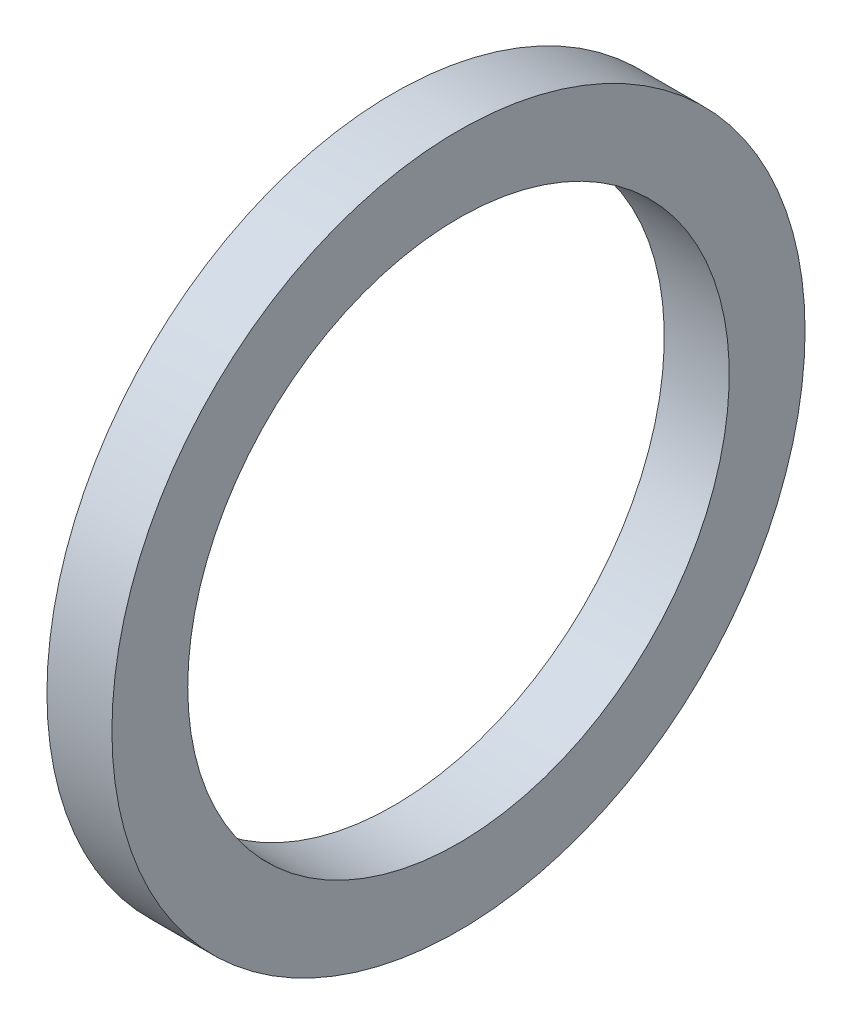
ISO-10303-21;
HEADER;
FILE_DESCRIPTION(('STEP AP214'),'2;1');
FILE_NAME('part.step','',(''),(''),'','','');
FILE_SCHEMA(('AUTOMOTIVE_DESIGN { 1 0 10303 214 1 1 1 1 }'));
ENDSEC;
DATA;
#1=APPLICATION_CONTEXT('core data for automotive mechanical design processes');
#2=APPLICATION_PROTOCOL_DEFINITION('international standard','automotive_design',2000,#1);
#3=PRODUCT_CONTEXT('',#1,'mechanical');
#4=PRODUCT('Part','Part','',(#3));
#5=PRODUCT_RELATED_PRODUCT_CATEGORY('part','',(#4));
#6=PRODUCT_DEFINITION_FORMATION('','',#4);
#7=PRODUCT_DEFINITION_CONTEXT('part definition',#1,'design');
#8=PRODUCT_DEFINITION('design','',#6,#7);
#9=PRODUCT_DEFINITION_SHAPE('','',#8);
#10=(LENGTH_UNIT() NAMED_UNIT(*) SI_UNIT(.MILLI.,.METRE.));
#11=(NAMED_UNIT(*) PLANE_ANGLE_UNIT() SI_UNIT($,.RADIAN.));
#12=(NAMED_UNIT(*) SI_UNIT($,.STERADIAN.) SOLID_ANGLE_UNIT());
#13=UNCERTAINTY_MEASURE_WITH_UNIT(LENGTH_MEASURE(1.E-05),#10,'distance_accuracy_value','');
#14=(GEOMETRIC_REPRESENTATION_CONTEXT(3) GLOBAL_UNCERTAINTY_ASSIGNED_CONTEXT((#13)) GLOBAL_UNIT_ASSIGNED_CONTEXT((#10,
#11,#12)) REPRESENTATION_CONTEXT('',''));
#15=CARTESIAN_POINT('',(0.,0.,0.));
#16=DIRECTION('',(0.,0.,1.));
#17=DIRECTION('',(1.,0.,0.));
#18=AXIS2_PLACEMENT_3D('',#15,#16,#17);
#19=CARTESIAN_POINT('',(0.,0.,0.));
#20=DIRECTION('',(-1.,0.,0.));
#21=DIRECTION('',(0.,0.,1.));
#22=AXIS2_PLACEMENT_3D('',#19,#20,#21);
#23=PLANE('',#22);
#24=CARTESIAN_POINT('',(0.,-12.5,0.));
#25=DIRECTION('',(-1.,0.,0.));
#26=DIRECTION('',(0.,0.,1.));
#27=AXIS2_PLACEMENT_3D('',#24,#25,#26);
#28=CIRCLE('',#27,16.);
#29=CARTESIAN_POINT('',(0.,-12.5,16.));
#30=VERTEX_POINT('',#29);
#31=EDGE_CURVE('E49',#30,#30,#28,.T.);
#32=ORIENTED_EDGE('',*,*,#31,.F.);
#33=EDGE_LOOP('',(#32));
#34=FACE_BOUND('',#33,.T.);
#35=CARTESIAN_POINT('',(0.,-12.5,0.));
#36=DIRECTION('',(-1.,0.,0.));
#37=DIRECTION('',(0.,0.,1.));
#38=AXIS2_PLACEMENT_3D('',#35,#36,#37);
#39=CIRCLE('',#38,12.5);
#40=CARTESIAN_POINT('',(0.,-12.5,12.5));
#41=VERTEX_POINT('',#40);
#42=EDGE_CURVE('E10',#41,#41,#39,.T.);
#43=ORIENTED_EDGE('',*,*,#42,.T.);
#44=EDGE_LOOP('',(#43));
#45=FACE_BOUND('',#44,.T.);
#46=ADVANCED_FACE('F35',(#34,#45),#23,.F.);
#47=CARTESIAN_POINT('',(0.,-12.5,0.));
#48=DIRECTION('',(-1.,0.,0.));
#49=DIRECTION('',(0.,0.,1.));
#50=AXIS2_PLACEMENT_3D('',#47,#48,#49);
#51=CYLINDRICAL_SURFACE('',#50,12.5);
#52=CARTESIAN_POINT('',(-3.,-12.5,0.));
#53=DIRECTION('',(-1.,0.,0.));
#54=DIRECTION('',(0.,0.,1.));
#55=AXIS2_PLACEMENT_3D('',#52,#53,#54);
#56=CIRCLE('',#55,12.5);
#57=CARTESIAN_POINT('',(-3.,-12.5,12.5));
#58=VERTEX_POINT('',#57);
#59=EDGE_CURVE('E41',#58,#58,#56,.T.);
#60=ORIENTED_EDGE('',*,*,#59,.T.);
#61=EDGE_LOOP('',(#60));
#62=FACE_BOUND('',#61,.T.);
#63=ORIENTED_EDGE('',*,*,#42,.F.);
#64=EDGE_LOOP('',(#63));
#65=FACE_BOUND('',#64,.T.);
#66=ADVANCED_FACE('F59',(#62,#65),#51,.F.);
#67=CARTESIAN_POINT('',(-3.,3.50000000000001,0.));
#68=DIRECTION('',(1.,0.,0.));
#69=DIRECTION('',(0.,0.,-1.));
#70=AXIS2_PLACEMENT_3D('',#67,#68,#69);
#71=PLANE('',#70);
#72=ORIENTED_EDGE('',*,*,#59,.F.);
#73=EDGE_LOOP('',(#72));
#74=FACE_BOUND('',#73,.T.);
#75=CARTESIAN_POINT('',(-3.,-12.5,0.));
#76=DIRECTION('',(-1.,0.,0.));
#77=DIRECTION('',(0.,0.,1.));
#78=AXIS2_PLACEMENT_3D('',#75,#76,#77);
#79=CIRCLE('',#78,16.);
#80=CARTESIAN_POINT('',(-3.,-12.5,16.));
#81=VERTEX_POINT('',#80);
#82=EDGE_CURVE('E45',#81,#81,#79,.T.);
#83=ORIENTED_EDGE('',*,*,#82,.T.);
#84=EDGE_LOOP('',(#83));
#85=FACE_BOUND('',#84,.T.);
#86=ADVANCED_FACE('F63',(#74,#85),#71,.F.);
#87=CARTESIAN_POINT('',(0.,-12.5,0.));
#88=DIRECTION('',(-1.,0.,0.));
#89=DIRECTION('',(0.,0.,1.));
#90=AXIS2_PLACEMENT_3D('',#87,#88,#89);
#91=CYLINDRICAL_SURFACE('',#90,16.);
#92=ORIENTED_EDGE('',*,*,#31,.T.);
#93=EDGE_LOOP('',(#92));
#94=FACE_BOUND('',#93,.T.);
#95=ORIENTED_EDGE('',*,*,#82,.F.);
#96=EDGE_LOOP('',(#95));
#97=FACE_BOUND('',#96,.T.);
#98=ADVANCED_FACE('F55',(#94,#97),#91,.T.);
#99=CLOSED_SHELL('',(#46,#66,#86,#98));
#100=MANIFOLD_SOLID_BREP('B2',#99);
#101=ADVANCED_BREP_SHAPE_REPRESENTATION('',(#18,#100),#14);
#102=SHAPE_DEFINITION_REPRESENTATION(#9,#101);
ENDSEC;
END-ISO-10303-21;
